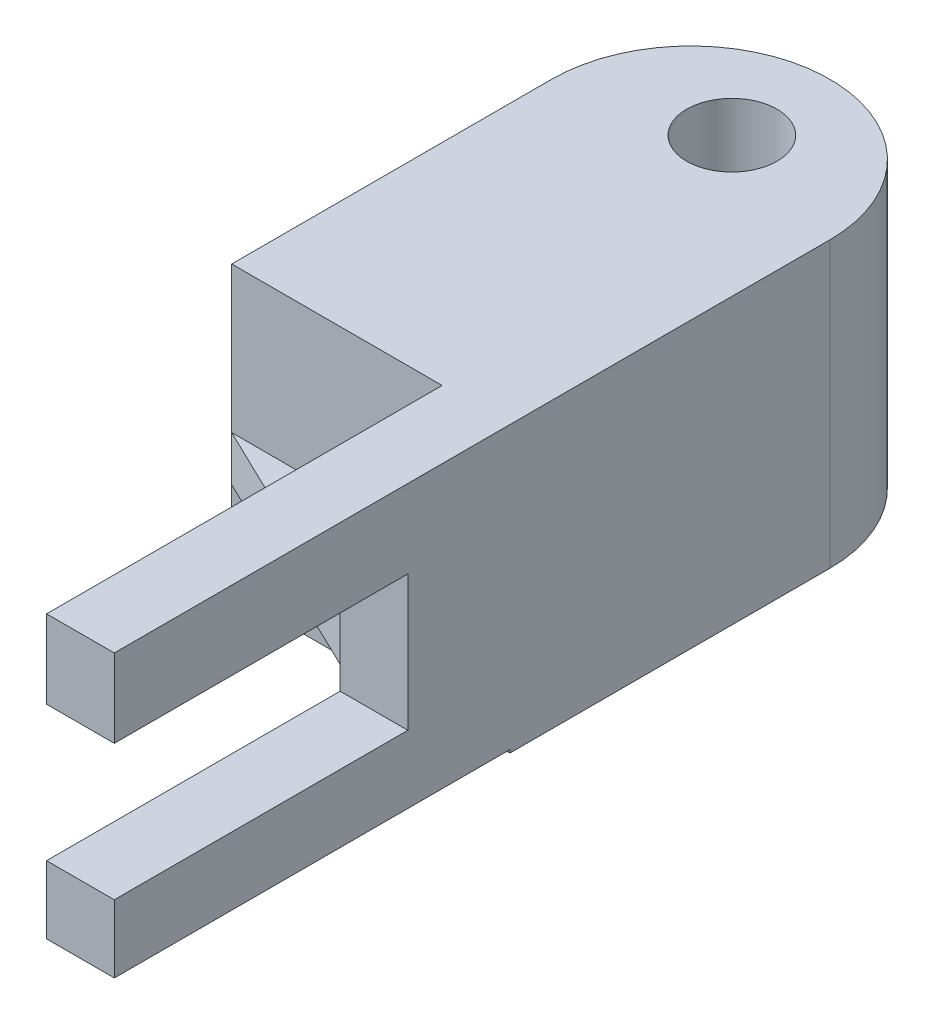
ISO-10303-21;
HEADER;
FILE_DESCRIPTION(('STEP AP214'),'2;1');
FILE_NAME('part.step','',(''),(''),'','','');
FILE_SCHEMA(('AUTOMOTIVE_DESIGN { 1 0 10303 214 1 1 1 1 }'));
ENDSEC;
DATA;
#1=APPLICATION_CONTEXT('core data for automotive mechanical design processes');
#2=APPLICATION_PROTOCOL_DEFINITION('international standard','automotive_design',2000,#1);
#3=PRODUCT_CONTEXT('',#1,'mechanical');
#4=PRODUCT('Part','Part','',(#3));
#5=PRODUCT_RELATED_PRODUCT_CATEGORY('part','',(#4));
#6=PRODUCT_DEFINITION_FORMATION('','',#4);
#7=PRODUCT_DEFINITION_CONTEXT('part definition',#1,'design');
#8=PRODUCT_DEFINITION('design','',#6,#7);
#9=PRODUCT_DEFINITION_SHAPE('','',#8);
#10=(LENGTH_UNIT() NAMED_UNIT(*) SI_UNIT(.MILLI.,.METRE.));
#11=(NAMED_UNIT(*) PLANE_ANGLE_UNIT() SI_UNIT($,.RADIAN.));
#12=(NAMED_UNIT(*) SI_UNIT($,.STERADIAN.) SOLID_ANGLE_UNIT());
#13=UNCERTAINTY_MEASURE_WITH_UNIT(LENGTH_MEASURE(1.E-05),#10,'distance_accuracy_value','');
#14=(GEOMETRIC_REPRESENTATION_CONTEXT(3) GLOBAL_UNCERTAINTY_ASSIGNED_CONTEXT((#13)) GLOBAL_UNIT_ASSIGNED_CONTEXT((#10,
#11,#12)) REPRESENTATION_CONTEXT('',''));
#15=CARTESIAN_POINT('',(0.,0.,0.));
#16=DIRECTION('',(0.,0.,1.));
#17=DIRECTION('',(1.,0.,0.));
#18=AXIS2_PLACEMENT_3D('',#15,#16,#17);
#19=CARTESIAN_POINT('',(0.,-0.66666666666667,0.));
#20=DIRECTION('',(0.,0.,1.));
#21=DIRECTION('',(0.,-1.,0.));
#22=AXIS2_PLACEMENT_3D('',#19,#20,#21);
#23=PLANE('',#22);
#24=DIRECTION('',(0.,1.,0.));
#25=VECTOR('',#24,1.);
#26=CARTESIAN_POINT('',(0.,0.,0.));
#27=LINE('',#26,#25);
#28=CARTESIAN_POINT('',(0.,0.,0.));
#29=VERTEX_POINT('',#28);
#30=CARTESIAN_POINT('',(0.,20.,0.));
#31=VERTEX_POINT('',#30);
#32=EDGE_CURVE('E144',#29,#31,#27,.T.);
#33=ORIENTED_EDGE('',*,*,#32,.T.);
#34=DIRECTION('',(-1.,0.,0.));
#35=VECTOR('',#34,1.);
#36=CARTESIAN_POINT('',(-46.5964093081324,20.,0.));
#37=LINE('',#36,#35);
#38=CARTESIAN_POINT('',(-46.5964093081324,20.,0.));
#39=VERTEX_POINT('',#38);
#40=EDGE_CURVE('E229',#31,#39,#37,.T.);
#41=ORIENTED_EDGE('',*,*,#40,.T.);
#42=DIRECTION('',(0.,1.,0.));
#43=VECTOR('',#42,1.);
#44=CARTESIAN_POINT('',(-46.5964093081324,-0.66666666666667,0.));
#45=LINE('',#44,#43);
#46=CARTESIAN_POINT('',(-46.5964093081324,-0.66666666666667,0.));
#47=VERTEX_POINT('',#46);
#48=EDGE_CURVE('E143',#47,#39,#45,.T.);
#49=ORIENTED_EDGE('',*,*,#48,.F.);
#50=DIRECTION('',(1.,0.,0.));
#51=VECTOR('',#50,1.);
#52=CARTESIAN_POINT('',(15.,-0.66666666666667,0.));
#53=LINE('',#52,#51);
#54=CARTESIAN_POINT('',(15.,-0.66666666666667,0.));
#55=VERTEX_POINT('',#54);
#56=EDGE_CURVE('E200',#47,#55,#53,.T.);
#57=ORIENTED_EDGE('',*,*,#56,.T.);
#58=DIRECTION('',(0.,1.,0.));
#59=VECTOR('',#58,1.);
#60=CARTESIAN_POINT('',(15.,-0.66666666666667,0.));
#61=LINE('',#60,#59);
#62=CARTESIAN_POINT('',(15.,0.,0.));
#63=VERTEX_POINT('',#62);
#64=EDGE_CURVE('E185',#55,#63,#61,.T.);
#65=ORIENTED_EDGE('',*,*,#64,.T.);
#66=DIRECTION('',(-1.,0.,0.));
#67=VECTOR('',#66,1.);
#68=CARTESIAN_POINT('',(15.,0.,0.));
#69=LINE('',#68,#67);
#70=EDGE_CURVE('E11',#63,#29,#69,.T.);
#71=ORIENTED_EDGE('',*,*,#70,.T.);
#72=EDGE_LOOP('',(#33,#41,#49,#57,#65,#71));
#73=FACE_BOUND('',#72,.T.);
#74=ADVANCED_FACE('F37',(#73),#23,.T.);
#75=CARTESIAN_POINT('',(15.,0.,87.5952380952381));
#76=DIRECTION('',(0.,1.,0.));
#77=DIRECTION('',(0.,0.,1.));
#78=AXIS2_PLACEMENT_3D('',#75,#76,#77);
#79=PLANE('',#78);
#80=DIRECTION('',(0.,0.,-1.));
#81=VECTOR('',#80,1.);
#82=CARTESIAN_POINT('',(0.,0.,87.5952380952381));
#83=LINE('',#82,#81);
#84=CARTESIAN_POINT('',(0.,0.,87.5952380952381));
#85=VERTEX_POINT('',#84);
#86=EDGE_CURVE('E139',#85,#29,#83,.T.);
#87=ORIENTED_EDGE('',*,*,#86,.T.);
#88=ORIENTED_EDGE('',*,*,#70,.F.);
#89=DIRECTION('',(0.,0.,-1.));
#90=VECTOR('',#89,1.);
#91=CARTESIAN_POINT('',(15.,0.,87.5952380952381));
#92=LINE('',#91,#90);
#93=CARTESIAN_POINT('',(15.,0.,87.5952380952381));
#94=VERTEX_POINT('',#93);
#95=EDGE_CURVE('E97',#94,#63,#92,.T.);
#96=ORIENTED_EDGE('',*,*,#95,.F.);
#97=DIRECTION('',(-1.,0.,0.));
#98=VECTOR('',#97,1.);
#99=CARTESIAN_POINT('',(15.,0.,87.5952380952381));
#100=LINE('',#99,#98);
#101=EDGE_CURVE('E135',#94,#85,#100,.T.);
#102=ORIENTED_EDGE('',*,*,#101,.T.);
#103=EDGE_LOOP('',(#87,#88,#96,#102));
#104=FACE_BOUND('',#103,.T.);
#105=ADVANCED_FACE('F39',(#104),#79,.F.);
#106=CARTESIAN_POINT('',(15.,62.3333333333333,0.));
#107=DIRECTION('',(0.,-1.,0.));
#108=DIRECTION('',(0.,0.,-1.));
#109=AXIS2_PLACEMENT_3D('',#106,#107,#108);
#110=PLANE('',#109);
#111=CARTESIAN_POINT('',(-15.9143856082834,62.3333333333333,-80.0720941454407));
#112=DIRECTION('',(0.,1.,0.));
#113=DIRECTION('',(0.,0.,1.));
#114=AXIS2_PLACEMENT_3D('',#111,#112,#113);
#115=CIRCLE('',#114,10.);
#116=CARTESIAN_POINT('',(-15.9143856082834,62.3333333333333,-70.0720941454407));
#117=VERTEX_POINT('',#116);
#118=EDGE_CURVE('E218',#117,#117,#115,.T.);
#119=ORIENTED_EDGE('',*,*,#118,.F.);
#120=EDGE_LOOP('',(#119));
#121=FACE_BOUND('',#120,.T.);
#122=DIRECTION('',(0.,0.,1.));
#123=VECTOR('',#122,1.);
#124=CARTESIAN_POINT('',(0.,62.3333333333333,0.));
#125=LINE('',#124,#123);
#126=CARTESIAN_POINT('',(0.,62.3333333333333,0.));
#127=VERTEX_POINT('',#126);
#128=CARTESIAN_POINT('',(0.,62.3333333333333,87.5952380952381));
#129=VERTEX_POINT('',#128);
#130=EDGE_CURVE('E147',#127,#129,#125,.T.);
#131=ORIENTED_EDGE('',*,*,#130,.T.);
#132=DIRECTION('',(-1.,0.,0.));
#133=VECTOR('',#132,1.);
#134=CARTESIAN_POINT('',(15.,62.3333333333333,87.5952380952381));
#135=LINE('',#134,#133);
#136=CARTESIAN_POINT('',(15.,62.3333333333333,87.5952380952381));
#137=VERTEX_POINT('',#136);
#138=EDGE_CURVE('E45',#137,#129,#135,.T.);
#139=ORIENTED_EDGE('',*,*,#138,.F.);
#140=DIRECTION('',(0.,0.,1.));
#141=VECTOR('',#140,1.);
#142=CARTESIAN_POINT('',(15.,62.3333333333333,0.));
#143=LINE('',#142,#141);
#144=CARTESIAN_POINT('',(15.,62.3333333333333,-70.8647021808204));
#145=VERTEX_POINT('',#144);
#146=EDGE_CURVE('E180',#145,#137,#143,.T.);
#147=ORIENTED_EDGE('',*,*,#146,.F.);
#148=CARTESIAN_POINT('',(-15.7982046540662,62.3333333333333,-70.8647021808204));
#149=DIRECTION('',(0.,1.,0.));
#150=DIRECTION('',(0.,0.,-1.));
#151=AXIS2_PLACEMENT_3D('',#148,#149,#150);
#152=CIRCLE('',#151,30.7982046540662);
#153=CARTESIAN_POINT('',(-46.5964093081324,62.3333333333333,-70.8647021808204));
#154=VERTEX_POINT('',#153);
#155=EDGE_CURVE('E204',#145,#154,#152,.T.);
#156=ORIENTED_EDGE('',*,*,#155,.T.);
#157=DIRECTION('',(0.,0.,1.));
#158=VECTOR('',#157,1.);
#159=CARTESIAN_POINT('',(-46.5964093081324,62.3333333333333,0.));
#160=LINE('',#159,#158);
#161=CARTESIAN_POINT('',(-46.5964093081324,62.3333333333333,0.));
#162=VERTEX_POINT('',#161);
#163=EDGE_CURVE('E201',#154,#162,#160,.T.);
#164=ORIENTED_EDGE('',*,*,#163,.T.);
#165=DIRECTION('',(1.,0.,0.));
#166=VECTOR('',#165,1.);
#167=CARTESIAN_POINT('',(0.,62.3333333333333,0.));
#168=LINE('',#167,#166);
#169=EDGE_CURVE('E198',#162,#127,#168,.T.);
#170=ORIENTED_EDGE('',*,*,#169,.T.);
#171=EDGE_LOOP('',(#131,#139,#147,#156,#164,#170));
#172=FACE_BOUND('',#171,.T.);
#173=ADVANCED_FACE('F300',(#121,#172),#110,.F.);
#174=CARTESIAN_POINT('',(15.,62.3333333333333,87.5952380952381));
#175=DIRECTION('',(0.,0.,-1.));
#176=DIRECTION('',(-1.,0.,0.));
#177=AXIS2_PLACEMENT_3D('',#174,#175,#176);
#178=PLANE('',#177);
#179=DIRECTION('',(0.,-1.,0.));
#180=VECTOR('',#179,1.);
#181=CARTESIAN_POINT('',(0.,62.3333333333333,87.5952380952381));
#182=LINE('',#181,#180);
#183=CARTESIAN_POINT('',(0.,45.,87.5952380952381));
#184=VERTEX_POINT('',#183);
#185=EDGE_CURVE('E149',#129,#184,#182,.T.);
#186=ORIENTED_EDGE('',*,*,#185,.T.);
#187=DIRECTION('',(-1.,0.,0.));
#188=VECTOR('',#187,1.);
#189=CARTESIAN_POINT('',(15.,45.,87.5952380952381));
#190=LINE('',#189,#188);
#191=CARTESIAN_POINT('',(15.,45.,87.5952380952381));
#192=VERTEX_POINT('',#191);
#193=EDGE_CURVE('E160',#192,#184,#190,.T.);
#194=ORIENTED_EDGE('',*,*,#193,.F.);
#195=DIRECTION('',(0.,-1.,0.));
#196=VECTOR('',#195,1.);
#197=CARTESIAN_POINT('',(15.,62.3333333333333,87.5952380952381));
#198=LINE('',#197,#196);
#199=EDGE_CURVE('E169',#137,#192,#198,.T.);
#200=ORIENTED_EDGE('',*,*,#199,.F.);
#201=ORIENTED_EDGE('',*,*,#138,.T.);
#202=EDGE_LOOP('',(#186,#194,#200,#201));
#203=FACE_BOUND('',#202,.T.);
#204=ADVANCED_FACE('F167',(#203),#178,.F.);
#205=CARTESIAN_POINT('',(15.,45.,87.5952380952381));
#206=DIRECTION('',(0.,1.,0.));
#207=DIRECTION('',(0.,0.,1.));
#208=AXIS2_PLACEMENT_3D('',#205,#206,#207);
#209=PLANE('',#208);
#210=DIRECTION('',(0.,0.,-1.));
#211=VECTOR('',#210,1.);
#212=CARTESIAN_POINT('',(0.,45.,87.5952380952381));
#213=LINE('',#212,#211);
#214=CARTESIAN_POINT('',(0.,45.,22.5952380952381));
#215=VERTEX_POINT('',#214);
#216=EDGE_CURVE('E151',#184,#215,#213,.T.);
#217=ORIENTED_EDGE('',*,*,#216,.T.);
#218=DIRECTION('',(-1.,0.,0.));
#219=VECTOR('',#218,1.);
#220=CARTESIAN_POINT('',(15.,45.,22.5952380952381));
#221=LINE('',#220,#219);
#222=CARTESIAN_POINT('',(15.,45.,22.5952380952381));
#223=VERTEX_POINT('',#222);
#224=EDGE_CURVE('E130',#223,#215,#221,.T.);
#225=ORIENTED_EDGE('',*,*,#224,.F.);
#226=DIRECTION('',(0.,0.,-1.));
#227=VECTOR('',#226,1.);
#228=CARTESIAN_POINT('',(15.,45.,87.5952380952381));
#229=LINE('',#228,#227);
#230=EDGE_CURVE('E118',#192,#223,#229,.T.);
#231=ORIENTED_EDGE('',*,*,#230,.F.);
#232=ORIENTED_EDGE('',*,*,#193,.T.);
#233=EDGE_LOOP('',(#217,#225,#231,#232));
#234=FACE_BOUND('',#233,.T.);
#235=ADVANCED_FACE('F179',(#234),#209,.F.);
#236=CARTESIAN_POINT('',(15.,45.,22.5952380952381));
#237=DIRECTION('',(0.,0.,-1.));
#238=DIRECTION('',(0.,1.,0.));
#239=AXIS2_PLACEMENT_3D('',#236,#237,#238);
#240=PLANE('',#239);
#241=DIRECTION('',(0.,-1.,0.));
#242=VECTOR('',#241,1.);
#243=CARTESIAN_POINT('',(0.,45.,22.5952380952381));
#244=LINE('',#243,#242);
#245=CARTESIAN_POINT('',(0.,15.,22.5952380952381));
#246=VERTEX_POINT('',#245);
#247=EDGE_CURVE('E127',#215,#246,#244,.T.);
#248=ORIENTED_EDGE('',*,*,#247,.T.);
#249=DIRECTION('',(-1.,0.,0.));
#250=VECTOR('',#249,1.);
#251=CARTESIAN_POINT('',(15.,15.,22.5952380952381));
#252=LINE('',#251,#250);
#253=CARTESIAN_POINT('',(15.,15.,22.5952380952381));
#254=VERTEX_POINT('',#253);
#255=EDGE_CURVE('E124',#254,#246,#252,.T.);
#256=ORIENTED_EDGE('',*,*,#255,.F.);
#257=DIRECTION('',(0.,-1.,0.));
#258=VECTOR('',#257,1.);
#259=CARTESIAN_POINT('',(15.,45.,22.5952380952381));
#260=LINE('',#259,#258);
#261=EDGE_CURVE('E111',#223,#254,#260,.T.);
#262=ORIENTED_EDGE('',*,*,#261,.F.);
#263=ORIENTED_EDGE('',*,*,#224,.T.);
#264=EDGE_LOOP('',(#248,#256,#262,#263));
#265=FACE_BOUND('',#264,.T.);
#266=ADVANCED_FACE('F125',(#265),#240,.F.);
#267=CARTESIAN_POINT('',(15.,15.,22.5952380952381));
#268=DIRECTION('',(0.,-1.,0.));
#269=DIRECTION('',(0.,0.,-1.));
#270=AXIS2_PLACEMENT_3D('',#267,#268,#269);
#271=PLANE('',#270);
#272=DIRECTION('',(0.,0.,1.));
#273=VECTOR('',#272,1.);
#274=CARTESIAN_POINT('',(0.,15.,22.5952380952381));
#275=LINE('',#274,#273);
#276=CARTESIAN_POINT('',(0.,15.,87.5952380952381));
#277=VERTEX_POINT('',#276);
#278=EDGE_CURVE('E154',#246,#277,#275,.T.);
#279=ORIENTED_EDGE('',*,*,#278,.T.);
#280=DIRECTION('',(-1.,0.,0.));
#281=VECTOR('',#280,1.);
#282=CARTESIAN_POINT('',(15.,15.,87.5952380952381));
#283=LINE('',#282,#281);
#284=CARTESIAN_POINT('',(15.,15.,87.5952380952381));
#285=VERTEX_POINT('',#284);
#286=EDGE_CURVE('E131',#285,#277,#283,.T.);
#287=ORIENTED_EDGE('',*,*,#286,.F.);
#288=DIRECTION('',(0.,0.,1.));
#289=VECTOR('',#288,1.);
#290=CARTESIAN_POINT('',(15.,15.,22.5952380952381));
#291=LINE('',#290,#289);
#292=EDGE_CURVE('E115',#254,#285,#291,.T.);
#293=ORIENTED_EDGE('',*,*,#292,.F.);
#294=ORIENTED_EDGE('',*,*,#255,.T.);
#295=EDGE_LOOP('',(#279,#287,#293,#294));
#296=FACE_BOUND('',#295,.T.);
#297=ADVANCED_FACE('F133',(#296),#271,.F.);
#298=CARTESIAN_POINT('',(15.,15.,87.5952380952381));
#299=DIRECTION('',(0.,0.,-1.));
#300=DIRECTION('',(-1.,0.,0.));
#301=AXIS2_PLACEMENT_3D('',#298,#299,#300);
#302=PLANE('',#301);
#303=DIRECTION('',(0.,-1.,0.));
#304=VECTOR('',#303,1.);
#305=CARTESIAN_POINT('',(0.,15.,87.5952380952381));
#306=LINE('',#305,#304);
#307=EDGE_CURVE('E91',#277,#85,#306,.T.);
#308=ORIENTED_EDGE('',*,*,#307,.T.);
#309=ORIENTED_EDGE('',*,*,#101,.F.);
#310=DIRECTION('',(0.,-1.,0.));
#311=VECTOR('',#310,1.);
#312=CARTESIAN_POINT('',(15.,15.,87.5952380952381));
#313=LINE('',#312,#311);
#314=EDGE_CURVE('E61',#285,#94,#313,.T.);
#315=ORIENTED_EDGE('',*,*,#314,.F.);
#316=ORIENTED_EDGE('',*,*,#286,.T.);
#317=EDGE_LOOP('',(#308,#309,#315,#316));
#318=FACE_BOUND('',#317,.T.);
#319=ADVANCED_FACE('F324',(#318),#302,.F.);
#320=CARTESIAN_POINT('',(15.,0.,0.));
#321=DIRECTION('',(1.,0.,0.));
#322=DIRECTION('',(0.,0.,-1.));
#323=AXIS2_PLACEMENT_3D('',#320,#321,#322);
#324=PLANE('',#323);
#325=ORIENTED_EDGE('',*,*,#95,.T.);
#326=ORIENTED_EDGE('',*,*,#64,.F.);
#327=DIRECTION('',(0.,0.,-1.));
#328=VECTOR('',#327,1.);
#329=CARTESIAN_POINT('',(15.,-0.66666666666667,0.));
#330=LINE('',#329,#328);
#331=CARTESIAN_POINT('',(15.,-0.666666666666663,-70.8647021808204));
#332=VERTEX_POINT('',#331);
#333=EDGE_CURVE('E213',#55,#332,#330,.T.);
#334=ORIENTED_EDGE('',*,*,#333,.T.);
#335=DIRECTION('',(0.,1.,0.));
#336=VECTOR('',#335,1.);
#337=CARTESIAN_POINT('',(15.,-0.666666666666663,-70.8647021808204));
#338=LINE('',#337,#336);
#339=EDGE_CURVE('E188',#332,#145,#338,.T.);
#340=ORIENTED_EDGE('',*,*,#339,.T.);
#341=ORIENTED_EDGE('',*,*,#146,.T.);
#342=ORIENTED_EDGE('',*,*,#199,.T.);
#343=ORIENTED_EDGE('',*,*,#230,.T.);
#344=ORIENTED_EDGE('',*,*,#261,.T.);
#345=ORIENTED_EDGE('',*,*,#292,.T.);
#346=ORIENTED_EDGE('',*,*,#314,.T.);
#347=EDGE_LOOP('',(#325,#326,#334,#340,#341,#342,#343,#344,#345,#346));
#348=FACE_BOUND('',#347,.T.);
#349=ADVANCED_FACE('F113',(#348),#324,.T.);
#350=CARTESIAN_POINT('',(0.,0.,0.));
#351=DIRECTION('',(1.,0.,0.));
#352=DIRECTION('',(0.,0.,-1.));
#353=AXIS2_PLACEMENT_3D('',#350,#351,#352);
#354=PLANE('',#353);
#355=CARTESIAN_POINT('',(0.,30.,0.));
#356=VERTEX_POINT('',#355);
#357=EDGE_CURVE('E142',#356,#127,#27,.T.);
#358=ORIENTED_EDGE('',*,*,#357,.F.);
#359=DIRECTION('',(0.,0.,-1.));
#360=VECTOR('',#359,1.);
#361=CARTESIAN_POINT('',(0.,30.,0.));
#362=LINE('',#361,#360);
#363=CARTESIAN_POINT('',(0.,30.,22.5158126156089));
#364=VERTEX_POINT('',#363);
#365=EDGE_CURVE('E239',#364,#356,#362,.T.);
#366=ORIENTED_EDGE('',*,*,#365,.F.);
#367=DIRECTION('',(0.,-1.,0.));
#368=VECTOR('',#367,1.);
#369=CARTESIAN_POINT('',(0.,30.,22.5158126156089));
#370=LINE('',#369,#368);
#371=CARTESIAN_POINT('',(0.,20.,22.5158126156089));
#372=VERTEX_POINT('',#371);
#373=EDGE_CURVE('E221',#364,#372,#370,.T.);
#374=ORIENTED_EDGE('',*,*,#373,.T.);
#375=DIRECTION('',(0.,0.,-1.));
#376=VECTOR('',#375,1.);
#377=CARTESIAN_POINT('',(0.,20.,0.));
#378=LINE('',#377,#376);
#379=EDGE_CURVE('E232',#372,#31,#378,.T.);
#380=ORIENTED_EDGE('',*,*,#379,.T.);
#381=ORIENTED_EDGE('',*,*,#32,.F.);
#382=ORIENTED_EDGE('',*,*,#86,.F.);
#383=ORIENTED_EDGE('',*,*,#307,.F.);
#384=ORIENTED_EDGE('',*,*,#278,.F.);
#385=ORIENTED_EDGE('',*,*,#247,.F.);
#386=ORIENTED_EDGE('',*,*,#216,.F.);
#387=ORIENTED_EDGE('',*,*,#185,.F.);
#388=ORIENTED_EDGE('',*,*,#130,.F.);
#389=EDGE_LOOP('',(#358,#366,#374,#380,#381,#382,#383,#384,#385,#386,#387,#388));
#390=FACE_BOUND('',#389,.T.);
#391=ADVANCED_FACE('F176',(#390),#354,.F.);
#392=DIRECTION('',(-1.,0.,0.));
#393=VECTOR('',#392,1.);
#394=CARTESIAN_POINT('',(-46.5964093081324,30.,0.));
#395=LINE('',#394,#393);
#396=CARTESIAN_POINT('',(-46.5964093081324,30.,0.));
#397=VERTEX_POINT('',#396);
#398=EDGE_CURVE('E228',#356,#397,#395,.T.);
#399=ORIENTED_EDGE('',*,*,#398,.F.);
#400=ORIENTED_EDGE('',*,*,#357,.T.);
#401=ORIENTED_EDGE('',*,*,#169,.F.);
#402=EDGE_CURVE('E195',#397,#162,#45,.T.);
#403=ORIENTED_EDGE('',*,*,#402,.F.);
#404=EDGE_LOOP('',(#399,#400,#401,#403));
#405=FACE_BOUND('',#404,.T.);
#406=ADVANCED_FACE('F258',(#405),#23,.T.);
#407=CARTESIAN_POINT('',(-46.5964093081324,-0.66666666666667,0.));
#408=DIRECTION('',(-1.,0.,0.));
#409=DIRECTION('',(0.,0.,1.));
#410=AXIS2_PLACEMENT_3D('',#407,#408,#409);
#411=PLANE('',#410);
#412=ORIENTED_EDGE('',*,*,#163,.F.);
#413=DIRECTION('',(0.,1.,0.));
#414=VECTOR('',#413,1.);
#415=CARTESIAN_POINT('',(-46.5964093081324,-0.666666666666663,-70.8647021808204));
#416=LINE('',#415,#414);
#417=CARTESIAN_POINT('',(-46.5964093081324,-0.666666666666663,-70.8647021808204));
#418=VERTEX_POINT('',#417);
#419=EDGE_CURVE('E192',#418,#154,#416,.T.);
#420=ORIENTED_EDGE('',*,*,#419,.F.);
#421=DIRECTION('',(0.,0.,1.));
#422=VECTOR('',#421,1.);
#423=CARTESIAN_POINT('',(-46.5964093081324,-0.66666666666667,0.));
#424=LINE('',#423,#422);
#425=EDGE_CURVE('E189',#418,#47,#424,.T.);
#426=ORIENTED_EDGE('',*,*,#425,.T.);
#427=ORIENTED_EDGE('',*,*,#48,.T.);
#428=DIRECTION('',(0.,-1.,0.));
#429=VECTOR('',#428,1.);
#430=CARTESIAN_POINT('',(-46.5964093081324,30.,0.));
#431=LINE('',#430,#429);
#432=EDGE_CURVE('E226',#397,#39,#431,.T.);
#433=ORIENTED_EDGE('',*,*,#432,.F.);
#434=ORIENTED_EDGE('',*,*,#402,.T.);
#435=EDGE_LOOP('',(#412,#420,#426,#427,#433,#434));
#436=FACE_BOUND('',#435,.T.);
#437=ADVANCED_FACE('F264',(#436),#411,.T.);
#438=CARTESIAN_POINT('',(-15.7982046540662,-0.666666666666663,-70.8647021808204));
#439=DIRECTION('',(0.,1.,0.));
#440=DIRECTION('',(0.,0.,1.));
#441=AXIS2_PLACEMENT_3D('',#438,#439,#440);
#442=CYLINDRICAL_SURFACE('',#441,30.7982046540662);
#443=ORIENTED_EDGE('',*,*,#155,.F.);
#444=ORIENTED_EDGE('',*,*,#339,.F.);
#445=CARTESIAN_POINT('',(-15.7982046540662,-0.666666666666663,-70.8647021808204));
#446=DIRECTION('',(0.,1.,0.));
#447=DIRECTION('',(0.,0.,-1.));
#448=AXIS2_PLACEMENT_3D('',#445,#446,#447);
#449=CIRCLE('',#448,30.7982046540662);
#450=EDGE_CURVE('E210',#332,#418,#449,.T.);
#451=ORIENTED_EDGE('',*,*,#450,.T.);
#452=ORIENTED_EDGE('',*,*,#419,.T.);
#453=EDGE_LOOP('',(#443,#444,#451,#452));
#454=FACE_BOUND('',#453,.T.);
#455=ADVANCED_FACE('F298',(#454),#442,.T.);
#456=CARTESIAN_POINT('',(-15.7982046540662,-0.666666666666663,-70.8647021808204));
#457=DIRECTION('',(0.,-1.,0.));
#458=DIRECTION('',(0.,0.,-1.));
#459=AXIS2_PLACEMENT_3D('',#456,#457,#458);
#460=PLANE('',#459);
#461=ORIENTED_EDGE('',*,*,#56,.F.);
#462=ORIENTED_EDGE('',*,*,#425,.F.);
#463=ORIENTED_EDGE('',*,*,#450,.F.);
#464=ORIENTED_EDGE('',*,*,#333,.F.);
#465=EDGE_LOOP('',(#461,#462,#463,#464));
#466=FACE_BOUND('',#465,.T.);
#467=ADVANCED_FACE('F299',(#466),#460,.T.);
#468=CARTESIAN_POINT('',(-15.9143856082834,2.33333333333333,-80.0720941454407));
#469=DIRECTION('',(0.,1.,0.));
#470=DIRECTION('',(0.,0.,1.));
#471=AXIS2_PLACEMENT_3D('',#468,#469,#470);
#472=CYLINDRICAL_SURFACE('',#471,10.);
#473=CARTESIAN_POINT('',(-15.9143856082834,2.33333333333333,-80.0720941454407));
#474=DIRECTION('',(0.,1.,0.));
#475=DIRECTION('',(0.,0.,1.));
#476=AXIS2_PLACEMENT_3D('',#473,#474,#475);
#477=CIRCLE('',#476,10.);
#478=CARTESIAN_POINT('',(-15.9143856082834,2.33333333333333,-70.0720941454407));
#479=VERTEX_POINT('',#478);
#480=EDGE_CURVE('E207',#479,#479,#477,.T.);
#481=CARTESIAN_POINT('',(-15.9143856082834,2.33333333333333,-70.0720941454407));
#482=CARTESIAN_POINT('',(-15.9143856082834,2.95833333333333,-70.0720941454407));
#483=CARTESIAN_POINT('',(-15.9143856082834,3.58333333333333,-70.0720941454407));
#484=CARTESIAN_POINT('',(-15.9143856082834,4.83333333333333,-70.0720941454407));
#485=CARTESIAN_POINT('',(-15.9143856082834,5.45833333333333,-70.0720941454407));
#486=CARTESIAN_POINT('',(-15.9143856082834,6.70833333333333,-70.0720941454407));
#487=CARTESIAN_POINT('',(-15.9143856082834,7.33333333333333,-70.0720941454407));
#488=CARTESIAN_POINT('',(-15.9143856082834,8.58333333333333,-70.0720941454407));
#489=CARTESIAN_POINT('',(-15.9143856082834,9.20833333333333,-70.0720941454407));
#490=CARTESIAN_POINT('',(-15.9143856082834,10.4583333333333,-70.0720941454407));
#491=CARTESIAN_POINT('',(-15.9143856082834,11.0833333333333,-70.0720941454407));
#492=CARTESIAN_POINT('',(-15.9143856082834,12.3333333333333,-70.0720941454407));
#493=CARTESIAN_POINT('',(-15.9143856082834,12.9583333333333,-70.0720941454407));
#494=CARTESIAN_POINT('',(-15.9143856082834,14.2083333333333,-70.0720941454407));
#495=CARTESIAN_POINT('',(-15.9143856082834,14.8333333333333,-70.0720941454407));
#496=CARTESIAN_POINT('',(-15.9143856082834,16.0833333333333,-70.0720941454407));
#497=CARTESIAN_POINT('',(-15.9143856082834,16.7083333333333,-70.0720941454407));
#498=CARTESIAN_POINT('',(-15.9143856082834,17.9583333333333,-70.0720941454407));
#499=CARTESIAN_POINT('',(-15.9143856082834,18.5833333333333,-70.0720941454407));
#500=CARTESIAN_POINT('',(-15.9143856082834,19.8333333333333,-70.0720941454407));
#501=CARTESIAN_POINT('',(-15.9143856082834,20.4583333333333,-70.0720941454407));
#502=CARTESIAN_POINT('',(-15.9143856082834,21.7083333333333,-70.0720941454407));
#503=CARTESIAN_POINT('',(-15.9143856082834,22.3333333333333,-70.0720941454407));
#504=CARTESIAN_POINT('',(-15.9143856082834,23.5833333333333,-70.0720941454407));
#505=CARTESIAN_POINT('',(-15.9143856082834,24.2083333333333,-70.0720941454407));
#506=CARTESIAN_POINT('',(-15.9143856082834,25.4583333333333,-70.0720941454407));
#507=CARTESIAN_POINT('',(-15.9143856082834,26.0833333333333,-70.0720941454407));
#508=CARTESIAN_POINT('',(-15.9143856082834,27.3333333333333,-70.0720941454407));
#509=CARTESIAN_POINT('',(-15.9143856082834,27.9583333333333,-70.0720941454407));
#510=CARTESIAN_POINT('',(-15.9143856082834,29.2083333333333,-70.0720941454407));
#511=CARTESIAN_POINT('',(-15.9143856082834,29.8333333333333,-70.0720941454407));
#512=CARTESIAN_POINT('',(-15.9143856082834,31.0833333333333,-70.0720941454407));
#513=CARTESIAN_POINT('',(-15.9143856082834,31.7083333333333,-70.0720941454407));
#514=CARTESIAN_POINT('',(-15.9143856082834,32.9583333333333,-70.0720941454407));
#515=CARTESIAN_POINT('',(-15.9143856082834,33.5833333333333,-70.0720941454407));
#516=CARTESIAN_POINT('',(-15.9143856082834,34.8333333333333,-70.0720941454407));
#517=CARTESIAN_POINT('',(-15.9143856082834,35.4583333333333,-70.0720941454407));
#518=CARTESIAN_POINT('',(-15.9143856082834,36.7083333333333,-70.0720941454407));
#519=CARTESIAN_POINT('',(-15.9143856082834,37.3333333333333,-70.0720941454407));
#520=CARTESIAN_POINT('',(-15.9143856082834,38.5833333333333,-70.0720941454407));
#521=CARTESIAN_POINT('',(-15.9143856082834,39.2083333333333,-70.0720941454407));
#522=CARTESIAN_POINT('',(-15.9143856082834,40.4583333333333,-70.0720941454407));
#523=CARTESIAN_POINT('',(-15.9143856082834,41.0833333333333,-70.0720941454407));
#524=CARTESIAN_POINT('',(-15.9143856082834,42.3333333333333,-70.0720941454407));
#525=CARTESIAN_POINT('',(-15.9143856082834,42.9583333333333,-70.0720941454407));
#526=CARTESIAN_POINT('',(-15.9143856082834,44.2083333333333,-70.0720941454407));
#527=CARTESIAN_POINT('',(-15.9143856082834,44.8333333333333,-70.0720941454407));
#528=CARTESIAN_POINT('',(-15.9143856082834,46.0833333333333,-70.0720941454407));
#529=CARTESIAN_POINT('',(-15.9143856082834,46.7083333333333,-70.0720941454407));
#530=CARTESIAN_POINT('',(-15.9143856082834,47.9583333333333,-70.0720941454407));
#531=CARTESIAN_POINT('',(-15.9143856082834,48.5833333333333,-70.0720941454407));
#532=CARTESIAN_POINT('',(-15.9143856082834,49.8333333333333,-70.0720941454407));
#533=CARTESIAN_POINT('',(-15.9143856082834,50.4583333333333,-70.0720941454407));
#534=CARTESIAN_POINT('',(-15.9143856082834,51.7083333333333,-70.0720941454407));
#535=CARTESIAN_POINT('',(-15.9143856082834,52.3333333333333,-70.0720941454407));
#536=CARTESIAN_POINT('',(-15.9143856082834,53.5833333333333,-70.0720941454407));
#537=CARTESIAN_POINT('',(-15.9143856082834,54.2083333333333,-70.0720941454407));
#538=CARTESIAN_POINT('',(-15.9143856082834,55.4583333333333,-70.0720941454407));
#539=CARTESIAN_POINT('',(-15.9143856082834,56.0833333333333,-70.0720941454407));
#540=CARTESIAN_POINT('',(-15.9143856082834,57.3333333333333,-70.0720941454407));
#541=CARTESIAN_POINT('',(-15.9143856082834,57.9583333333333,-70.0720941454407));
#542=CARTESIAN_POINT('',(-15.9143856082834,59.2083333333333,-70.0720941454407));
#543=CARTESIAN_POINT('',(-15.9143856082834,59.8333333333333,-70.0720941454407));
#544=CARTESIAN_POINT('',(-15.9143856082834,61.0833333333333,-70.0720941454407));
#545=CARTESIAN_POINT('',(-15.9143856082834,61.7083333333333,-70.0720941454407));
#546=CARTESIAN_POINT('',(-15.9143856082834,62.3333333333333,-70.0720941454407));
#547=B_SPLINE_CURVE_WITH_KNOTS('',3,(#481,#482,#483,#484,#485,#486,#487,#488,#489,#490,#491,
#492,#493,#494,#495,#496,#497,#498,#499,#500,#501,#502,#503,#504,#505,#506,#507,#508,#509,#510,
#511,#512,#513,#514,#515,#516,#517,#518,#519,#520,#521,#522,#523,#524,#525,#526,#527,#528,#529,
#530,#531,#532,#533,#534,#535,#536,#537,#538,#539,#540,#541,#542,#543,#544,#545,#546),
.UNSPECIFIED.,.F.,.F.,(4,2,2,2,2,2,2,2,2,2,2,2,2,2,2,2,2,2,2,2,2,2,2,2,2,2,2,2,2,2,2,2,4),(0.,
1.875,3.75,5.625,7.5,9.375,11.25,13.125,15.,16.875,18.75,20.625,22.5,24.375,26.25,28.125,30.,
31.875,33.75,35.625,37.5,39.375,41.25,43.125,45.,46.875,48.75,50.625,52.5,54.375,56.25,58.125,
60.),.UNSPECIFIED.);
#548=EDGE_CURVE('BSEAM377',#479,#117,#547,.T.);
#549=ORIENTED_EDGE('',*,*,#480,.F.);
#550=ORIENTED_EDGE('',*,*,#118,.T.);
#551=ORIENTED_EDGE('',*,*,#548,.T.);
#552=ORIENTED_EDGE('',*,*,#548,.F.);
#553=EDGE_LOOP('',(#549,#551,#550,#552));
#554=FACE_BOUND('',#553,.T.);
#555=ADVANCED_FACE('F377',(#554),#472,.F.);
#556=CARTESIAN_POINT('',(-15.9143856082834,2.33333333333333,-80.0720941454407));
#557=DIRECTION('',(0.,1.,0.));
#558=DIRECTION('',(0.,0.,1.));
#559=AXIS2_PLACEMENT_3D('',#556,#557,#558);
#560=PLANE('',#559);
#561=ORIENTED_EDGE('',*,*,#480,.T.);
#562=EDGE_LOOP('',(#561));
#563=FACE_BOUND('',#562,.T.);
#564=ADVANCED_FACE('F391',(#563),#560,.T.);
#565=CARTESIAN_POINT('',(0.,30.,22.5158126156089));
#566=DIRECTION('',(0.43507803899664,0.,-0.900392747628966));
#567=DIRECTION('',(-0.900392747628966,0.,-0.43507803899664));
#568=AXIS2_PLACEMENT_3D('',#565,#566,#567);
#569=PLANE('',#568);
#570=DIRECTION('',(0.900392747628966,0.,0.43507803899664));
#571=VECTOR('',#570,1.);
#572=CARTESIAN_POINT('',(0.,20.,22.5158126156089));
#573=LINE('',#572,#571);
#574=EDGE_CURVE('E235',#39,#372,#573,.T.);
#575=ORIENTED_EDGE('',*,*,#574,.T.);
#576=ORIENTED_EDGE('',*,*,#373,.F.);
#577=DIRECTION('',(0.900392747628966,0.,0.43507803899664));
#578=VECTOR('',#577,1.);
#579=CARTESIAN_POINT('',(0.,30.,22.5158126156089));
#580=LINE('',#579,#578);
#581=EDGE_CURVE('E52',#397,#364,#580,.T.);
#582=ORIENTED_EDGE('',*,*,#581,.F.);
#583=ORIENTED_EDGE('',*,*,#432,.T.);
#584=EDGE_LOOP('',(#575,#576,#582,#583));
#585=FACE_BOUND('',#584,.T.);
#586=ADVANCED_FACE('F251',(#585),#569,.F.);
#587=CARTESIAN_POINT('',(0.,30.,0.));
#588=DIRECTION('',(0.,1.,0.));
#589=DIRECTION('',(0.,0.,1.));
#590=AXIS2_PLACEMENT_3D('',#587,#588,#589);
#591=PLANE('',#590);
#592=ORIENTED_EDGE('',*,*,#581,.T.);
#593=ORIENTED_EDGE('',*,*,#365,.T.);
#594=ORIENTED_EDGE('',*,*,#398,.T.);
#595=EDGE_LOOP('',(#592,#593,#594));
#596=FACE_BOUND('',#595,.T.);
#597=ADVANCED_FACE('F244',(#596),#591,.T.);
#598=CARTESIAN_POINT('',(0.,20.,0.));
#599=DIRECTION('',(0.,1.,0.));
#600=DIRECTION('',(0.,0.,1.));
#601=AXIS2_PLACEMENT_3D('',#598,#599,#600);
#602=PLANE('',#601);
#603=ORIENTED_EDGE('',*,*,#574,.F.);
#604=ORIENTED_EDGE('',*,*,#40,.F.);
#605=ORIENTED_EDGE('',*,*,#379,.F.);
#606=EDGE_LOOP('',(#603,#604,#605));
#607=FACE_BOUND('',#606,.T.);
#608=ADVANCED_FACE('F271',(#607),#602,.F.);
#609=CLOSED_SHELL('',(#74,#105,#173,#204,#235,#266,#297,#319,#349,#391,#406,#437,#455,#467,#555,
#564,#586,#597,#608));
#610=MANIFOLD_SOLID_BREP('B2',#609);
#611=ADVANCED_BREP_SHAPE_REPRESENTATION('',(#18,#610),#14);
#612=SHAPE_DEFINITION_REPRESENTATION(#9,#611);
ENDSEC;
END-ISO-10303-21;
